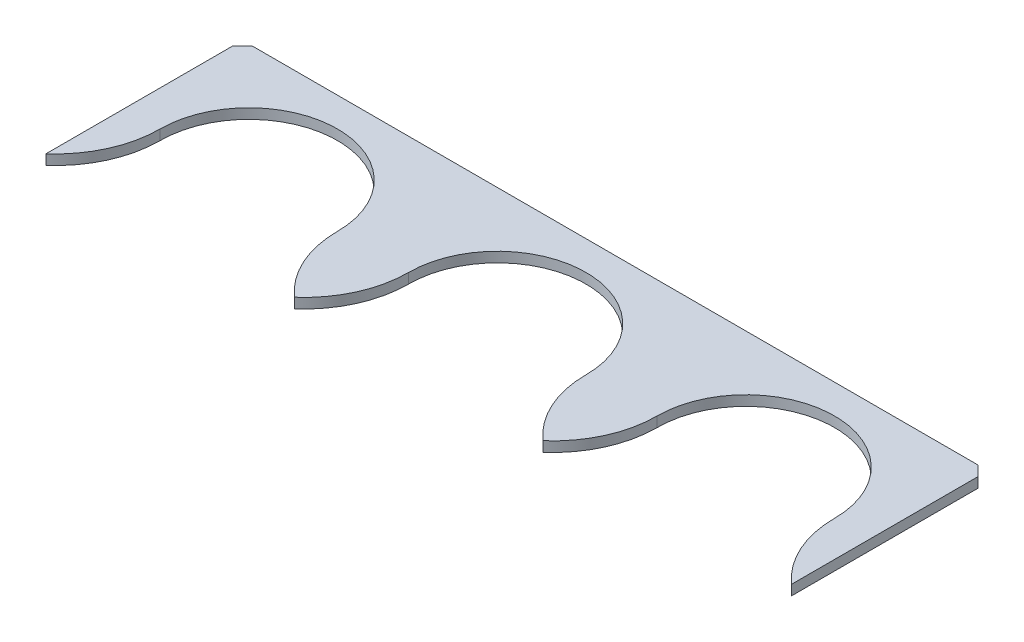
ISO-10303-21;
HEADER;
FILE_DESCRIPTION(('STEP AP214'),'2;1');
FILE_NAME('part.step','',(''),(''),'','','');
FILE_SCHEMA(('AUTOMOTIVE_DESIGN { 1 0 10303 214 1 1 1 1 }'));
ENDSEC;
DATA;
#1=APPLICATION_CONTEXT('core data for automotive mechanical design processes');
#2=APPLICATION_PROTOCOL_DEFINITION('international standard','automotive_design',2000,#1);
#3=PRODUCT_CONTEXT('',#1,'mechanical');
#4=PRODUCT('Part','Part','',(#3));
#5=PRODUCT_RELATED_PRODUCT_CATEGORY('part','',(#4));
#6=PRODUCT_DEFINITION_FORMATION('','',#4);
#7=PRODUCT_DEFINITION_CONTEXT('part definition',#1,'design');
#8=PRODUCT_DEFINITION('design','',#6,#7);
#9=PRODUCT_DEFINITION_SHAPE('','',#8);
#10=(LENGTH_UNIT() NAMED_UNIT(*) SI_UNIT(.MILLI.,.METRE.));
#11=(NAMED_UNIT(*) PLANE_ANGLE_UNIT() SI_UNIT($,.RADIAN.));
#12=(NAMED_UNIT(*) SI_UNIT($,.STERADIAN.) SOLID_ANGLE_UNIT());
#13=UNCERTAINTY_MEASURE_WITH_UNIT(LENGTH_MEASURE(1.E-05),#10,'distance_accuracy_value','');
#14=(GEOMETRIC_REPRESENTATION_CONTEXT(3) GLOBAL_UNCERTAINTY_ASSIGNED_CONTEXT((#13)) GLOBAL_UNIT_ASSIGNED_CONTEXT((#10,
#11,#12)) REPRESENTATION_CONTEXT('',''));
#15=CARTESIAN_POINT('',(0.,0.,0.));
#16=DIRECTION('',(0.,0.,1.));
#17=DIRECTION('',(1.,0.,0.));
#18=AXIS2_PLACEMENT_3D('',#15,#16,#17);
#19=CARTESIAN_POINT('',(-42.1859712464759,-6.35,34.3739942350874));
#20=DIRECTION('',(0.,1.,0.));
#21=DIRECTION('',(0.,0.,1.));
#22=AXIS2_PLACEMENT_3D('',#19,#20,#21);
#23=CYLINDRICAL_SURFACE('',#22,55.88);
#24=CARTESIAN_POINT('',(-42.1859712464759,0.,34.3739942350874));
#25=DIRECTION('',(0.,1.,0.));
#26=DIRECTION('',(0.,0.,1.));
#27=AXIS2_PLACEMENT_3D('',#24,#25,#26);
#28=CIRCLE('',#27,55.88);
#29=CARTESIAN_POINT('',(13.6940287535241,0.,34.3739942350874));
#30=VERTEX_POINT('',#29);
#31=CARTESIAN_POINT('',(-98.0659712464759,0.,34.3739942350875));
#32=VERTEX_POINT('',#31);
#33=EDGE_CURVE('E164',#30,#32,#28,.T.);
#34=ORIENTED_EDGE('',*,*,#33,.T.);
#35=DIRECTION('',(0.,1.,0.));
#36=VECTOR('',#35,1.);
#37=CARTESIAN_POINT('',(-98.0659712464759,-6.35,34.3739942350875));
#38=LINE('',#37,#36);
#39=CARTESIAN_POINT('',(-98.0659712464759,-6.35,34.3739942350875));
#40=VERTEX_POINT('',#39);
#41=EDGE_CURVE('E11',#40,#32,#38,.T.);
#42=ORIENTED_EDGE('',*,*,#41,.F.);
#43=CARTESIAN_POINT('',(-42.1859712464759,-6.35,34.3739942350874));
#44=DIRECTION('',(0.,1.,0.));
#45=DIRECTION('',(0.,0.,1.));
#46=AXIS2_PLACEMENT_3D('',#43,#44,#45);
#47=CIRCLE('',#46,55.88);
#48=CARTESIAN_POINT('',(13.6940287535241,-6.35,34.3739942350874));
#49=VERTEX_POINT('',#48);
#50=EDGE_CURVE('E196',#49,#40,#47,.T.);
#51=ORIENTED_EDGE('',*,*,#50,.F.);
#52=DIRECTION('',(0.,1.,0.));
#53=VECTOR('',#52,1.);
#54=CARTESIAN_POINT('',(13.6940287535241,-6.35,34.3739942350874));
#55=LINE('',#54,#53);
#56=EDGE_CURVE('E37',#49,#30,#55,.T.);
#57=ORIENTED_EDGE('',*,*,#56,.T.);
#58=EDGE_LOOP('',(#34,#42,#51,#57));
#59=FACE_BOUND('',#58,.T.);
#60=ADVANCED_FACE('F34',(#59),#23,.F.);
#61=CARTESIAN_POINT('',(-163.970614847835,-6.35,34.3739942350875));
#62=DIRECTION('',(0.,1.,0.));
#63=DIRECTION('',(0.,0.,1.));
#64=AXIS2_PLACEMENT_3D('',#61,#62,#63);
#65=CYLINDRICAL_SURFACE('',#64,65.9046436013589);
#66=CARTESIAN_POINT('',(-163.970614847835,0.,34.3739942350875));
#67=DIRECTION('',(0.,1.,0.));
#68=DIRECTION('',(0.,0.,1.));
#69=AXIS2_PLACEMENT_3D('',#66,#67,#68);
#70=CIRCLE('',#69,65.9046436013589);
#71=CARTESIAN_POINT('',(-120.494171246476,0.,83.9039942350875));
#72=VERTEX_POINT('',#71);
#73=EDGE_CURVE('E103',#32,#72,#70,.F.);
#74=ORIENTED_EDGE('',*,*,#73,.T.);
#75=DIRECTION('',(0.,1.,0.));
#76=VECTOR('',#75,1.);
#77=CARTESIAN_POINT('',(-120.494171246476,-6.35,83.9039942350875));
#78=LINE('',#77,#76);
#79=CARTESIAN_POINT('',(-120.494171246476,-6.35,83.9039942350875));
#80=VERTEX_POINT('',#79);
#81=EDGE_CURVE('E43',#80,#72,#78,.T.);
#82=ORIENTED_EDGE('',*,*,#81,.F.);
#83=CARTESIAN_POINT('',(-163.970614847835,-6.35,34.3739942350875));
#84=DIRECTION('',(0.,1.,0.));
#85=DIRECTION('',(0.,0.,1.));
#86=AXIS2_PLACEMENT_3D('',#83,#84,#85);
#87=CIRCLE('',#86,65.9046436013589);
#88=EDGE_CURVE('E51',#40,#80,#87,.F.);
#89=ORIENTED_EDGE('',*,*,#88,.F.);
#90=ORIENTED_EDGE('',*,*,#41,.T.);
#91=EDGE_LOOP('',(#74,#82,#89,#90));
#92=FACE_BOUND('',#91,.T.);
#93=ADVANCED_FACE('F238',(#92),#65,.T.);
#94=CARTESIAN_POINT('',(-120.494171246476,-6.35,25.1664942350875));
#95=DIRECTION('',(-1.,0.,0.));
#96=DIRECTION('',(0.,0.,1.));
#97=AXIS2_PLACEMENT_3D('',#94,#95,#96);
#98=PLANE('',#97);
#99=DIRECTION('',(0.,0.,1.));
#100=VECTOR('',#99,1.);
#101=CARTESIAN_POINT('',(-120.494171246476,0.,25.1664942350875));
#102=LINE('',#101,#100);
#103=CARTESIAN_POINT('',(-120.494171246476,0.,-33.5710057649125));
#104=VERTEX_POINT('',#103);
#105=EDGE_CURVE('E146',#104,#72,#102,.T.);
#106=ORIENTED_EDGE('',*,*,#105,.F.);
#107=DIRECTION('',(0.,1.,0.));
#108=VECTOR('',#107,1.);
#109=CARTESIAN_POINT('',(-120.494171246476,-6.35,-33.5710057649125));
#110=LINE('',#109,#108);
#111=CARTESIAN_POINT('',(-120.494171246476,-6.35,-33.5710057649125));
#112=VERTEX_POINT('',#111);
#113=EDGE_CURVE('E141',#112,#104,#110,.T.);
#114=ORIENTED_EDGE('',*,*,#113,.F.);
#115=DIRECTION('',(0.,0.,1.));
#116=VECTOR('',#115,1.);
#117=CARTESIAN_POINT('',(-120.494171246476,-6.35,25.1664942350875));
#118=LINE('',#117,#116);
#119=EDGE_CURVE('E145',#112,#80,#118,.T.);
#120=ORIENTED_EDGE('',*,*,#119,.T.);
#121=ORIENTED_EDGE('',*,*,#81,.T.);
#122=EDGE_LOOP('',(#106,#114,#120,#121));
#123=FACE_BOUND('',#122,.T.);
#124=ADVANCED_FACE('F143',(#123),#98,.T.);
#125=CARTESIAN_POINT('',(-222.089643416732,-6.35,68.0244664053438));
#126=DIRECTION('',(0.707106781186548,0.,0.707106781186547));
#127=DIRECTION('',(0.707106781186547,0.,-0.707106781186548));
#128=AXIS2_PLACEMENT_3D('',#125,#126,#127);
#129=PLANE('',#128);
#130=DIRECTION('',(0.707106781186547,0.,-0.707106781186548));
#131=VECTOR('',#130,1.);
#132=CARTESIAN_POINT('',(-222.089643416732,0.,68.0244664053438));
#133=LINE('',#132,#131);
#134=CARTESIAN_POINT('',(-114.144171246476,0.,-39.9210057649125));
#135=VERTEX_POINT('',#134);
#136=EDGE_CURVE('E193',#104,#135,#133,.T.);
#137=ORIENTED_EDGE('',*,*,#136,.T.);
#138=DIRECTION('',(0.,1.,0.));
#139=VECTOR('',#138,1.);
#140=CARTESIAN_POINT('',(-114.144171246476,-6.35,-39.9210057649125));
#141=LINE('',#140,#139);
#142=CARTESIAN_POINT('',(-114.144171246476,-6.35,-39.9210057649125));
#143=VERTEX_POINT('',#142);
#144=EDGE_CURVE('E149',#143,#135,#141,.T.);
#145=ORIENTED_EDGE('',*,*,#144,.F.);
#146=DIRECTION('',(0.707106781186547,0.,-0.707106781186548));
#147=VECTOR('',#146,1.);
#148=CARTESIAN_POINT('',(-222.089643416732,-6.35,68.0244664053438));
#149=LINE('',#148,#147);
#150=EDGE_CURVE('E152',#112,#143,#149,.T.);
#151=ORIENTED_EDGE('',*,*,#150,.F.);
#152=ORIENTED_EDGE('',*,*,#113,.T.);
#153=EDGE_LOOP('',(#137,#145,#151,#152));
#154=FACE_BOUND('',#153,.T.);
#155=ADVANCED_FACE('F153',(#154),#129,.F.);
#156=CARTESIAN_POINT('',(-264.947615586989,-6.35,-39.9210057649125));
#157=DIRECTION('',(0.,0.,1.));
#158=DIRECTION('',(1.,0.,0.));
#159=AXIS2_PLACEMENT_3D('',#156,#157,#158);
#160=PLANE('',#159);
#161=DIRECTION('',(1.,0.,0.));
#162=VECTOR('',#161,1.);
#163=CARTESIAN_POINT('',(-264.947615586989,0.,-39.9210057649125));
#164=LINE('',#163,#162);
#165=CARTESIAN_POINT('',(343.055828753524,0.,-39.9210057649126));
#166=VERTEX_POINT('',#165);
#167=EDGE_CURVE('E191',#135,#166,#164,.T.);
#168=ORIENTED_EDGE('',*,*,#167,.T.);
#169=DIRECTION('',(0.,1.,0.));
#170=VECTOR('',#169,1.);
#171=CARTESIAN_POINT('',(343.055828753524,-6.35,-39.9210057649126));
#172=LINE('',#171,#170);
#173=CARTESIAN_POINT('',(343.055828753524,-6.35,-39.9210057649126));
#174=VERTEX_POINT('',#173);
#175=EDGE_CURVE('E200',#174,#166,#172,.T.);
#176=ORIENTED_EDGE('',*,*,#175,.F.);
#177=DIRECTION('',(1.,0.,0.));
#178=VECTOR('',#177,1.);
#179=CARTESIAN_POINT('',(-264.947615586989,-6.35,-39.9210057649125));
#180=LINE('',#179,#178);
#181=EDGE_CURVE('E157',#143,#174,#180,.T.);
#182=ORIENTED_EDGE('',*,*,#181,.F.);
#183=ORIENTED_EDGE('',*,*,#144,.T.);
#184=EDGE_LOOP('',(#168,#176,#182,#183));
#185=FACE_BOUND('',#184,.T.);
#186=ADVANCED_FACE('F251',(#185),#160,.F.);
#187=CARTESIAN_POINT('',(71.5978565832693,-6.35,-311.378977935169));
#188=DIRECTION('',(-0.707106781186549,0.,0.707106781186546));
#189=DIRECTION('',(0.707106781186546,0.,0.707106781186549));
#190=AXIS2_PLACEMENT_3D('',#187,#188,#189);
#191=PLANE('',#190);
#192=DIRECTION('',(0.707106781186546,0.,0.707106781186549));
#193=VECTOR('',#192,1.);
#194=CARTESIAN_POINT('',(71.5978565832693,0.,-311.378977935169));
#195=LINE('',#194,#193);
#196=CARTESIAN_POINT('',(349.405828753524,0.,-33.5710057649123));
#197=VERTEX_POINT('',#196);
#198=EDGE_CURVE('E189',#166,#197,#195,.T.);
#199=ORIENTED_EDGE('',*,*,#198,.T.);
#200=DIRECTION('',(0.,1.,0.));
#201=VECTOR('',#200,1.);
#202=CARTESIAN_POINT('',(349.405828753524,-6.35,-33.5710057649123));
#203=LINE('',#202,#201);
#204=CARTESIAN_POINT('',(349.405828753524,-6.35,-33.5710057649123));
#205=VERTEX_POINT('',#204);
#206=EDGE_CURVE('E203',#205,#197,#203,.T.);
#207=ORIENTED_EDGE('',*,*,#206,.F.);
#208=DIRECTION('',(0.707106781186546,0.,0.707106781186549));
#209=VECTOR('',#208,1.);
#210=CARTESIAN_POINT('',(71.5978565832693,-6.35,-311.378977935169));
#211=LINE('',#210,#209);
#212=EDGE_CURVE('E308',#174,#205,#211,.T.);
#213=ORIENTED_EDGE('',*,*,#212,.F.);
#214=ORIENTED_EDGE('',*,*,#175,.T.);
#215=EDGE_LOOP('',(#199,#207,#213,#214));
#216=FACE_BOUND('',#215,.T.);
#217=ADVANCED_FACE('F254',(#216),#191,.F.);
#218=CARTESIAN_POINT('',(349.405828753524,-6.35,25.1664942350872));
#219=DIRECTION('',(-1.,0.,0.));
#220=DIRECTION('',(0.,0.,1.));
#221=AXIS2_PLACEMENT_3D('',#218,#219,#220);
#222=PLANE('',#221);
#223=DIRECTION('',(0.,0.,1.));
#224=VECTOR('',#223,1.);
#225=CARTESIAN_POINT('',(349.405828753524,0.,25.1664942350872));
#226=LINE('',#225,#224);
#227=CARTESIAN_POINT('',(349.405828753524,0.,83.9039942350875));
#228=VERTEX_POINT('',#227);
#229=EDGE_CURVE('E186',#197,#228,#226,.T.);
#230=ORIENTED_EDGE('',*,*,#229,.T.);
#231=DIRECTION('',(0.,1.,0.));
#232=VECTOR('',#231,1.);
#233=CARTESIAN_POINT('',(349.405828753524,-6.35,83.9039942350875));
#234=LINE('',#233,#232);
#235=CARTESIAN_POINT('',(349.405828753524,-6.35,83.9039942350875));
#236=VERTEX_POINT('',#235);
#237=EDGE_CURVE('E206',#236,#228,#234,.T.);
#238=ORIENTED_EDGE('',*,*,#237,.F.);
#239=DIRECTION('',(0.,0.,1.));
#240=VECTOR('',#239,1.);
#241=CARTESIAN_POINT('',(349.405828753524,-6.35,25.1664942350872));
#242=LINE('',#241,#240);
#243=EDGE_CURVE('E306',#205,#236,#242,.T.);
#244=ORIENTED_EDGE('',*,*,#243,.F.);
#245=ORIENTED_EDGE('',*,*,#206,.T.);
#246=EDGE_LOOP('',(#230,#238,#244,#245));
#247=FACE_BOUND('',#246,.T.);
#248=ADVANCED_FACE('F258',(#247),#222,.F.);
#249=CARTESIAN_POINT('',(392.807705224112,-6.35,34.3739942350875));
#250=DIRECTION('',(0.,1.,0.));
#251=DIRECTION('',(0.,0.,1.));
#252=AXIS2_PLACEMENT_3D('',#249,#250,#251);
#253=CYLINDRICAL_SURFACE('',#252,65.8554764705882);
#254=CARTESIAN_POINT('',(392.807705224112,0.,34.3739942350875));
#255=DIRECTION('',(0.,1.,0.));
#256=DIRECTION('',(0.,0.,1.));
#257=AXIS2_PLACEMENT_3D('',#254,#255,#256);
#258=CIRCLE('',#257,65.8554764705882);
#259=CARTESIAN_POINT('',(326.952228753524,0.,34.3739942350875));
#260=VERTEX_POINT('',#259);
#261=EDGE_CURVE('E183',#260,#228,#258,.T.);
#262=ORIENTED_EDGE('',*,*,#261,.F.);
#263=DIRECTION('',(0.,1.,0.));
#264=VECTOR('',#263,1.);
#265=CARTESIAN_POINT('',(326.952228753524,-6.35,34.3739942350875));
#266=LINE('',#265,#264);
#267=CARTESIAN_POINT('',(326.952228753524,-6.35,34.3739942350875));
#268=VERTEX_POINT('',#267);
#269=EDGE_CURVE('E208',#268,#260,#266,.T.);
#270=ORIENTED_EDGE('',*,*,#269,.F.);
#271=CARTESIAN_POINT('',(392.807705224112,-6.35,34.3739942350875));
#272=DIRECTION('',(0.,1.,0.));
#273=DIRECTION('',(0.,0.,1.));
#274=AXIS2_PLACEMENT_3D('',#271,#272,#273);
#275=CIRCLE('',#274,65.8554764705882);
#276=EDGE_CURVE('E303',#268,#236,#275,.T.);
#277=ORIENTED_EDGE('',*,*,#276,.T.);
#278=ORIENTED_EDGE('',*,*,#237,.T.);
#279=EDGE_LOOP('',(#262,#270,#277,#278));
#280=FACE_BOUND('',#279,.T.);
#281=ADVANCED_FACE('F262',(#280),#253,.T.);
#282=CARTESIAN_POINT('',(271.072228753524,-6.35,34.3739942350874));
#283=DIRECTION('',(0.,1.,0.));
#284=DIRECTION('',(0.,0.,1.));
#285=AXIS2_PLACEMENT_3D('',#282,#283,#284);
#286=CYLINDRICAL_SURFACE('',#285,55.88);
#287=CARTESIAN_POINT('',(271.072228753524,0.,34.3739942350874));
#288=DIRECTION('',(0.,1.,0.));
#289=DIRECTION('',(0.,0.,1.));
#290=AXIS2_PLACEMENT_3D('',#287,#288,#289);
#291=CIRCLE('',#290,55.88);
#292=CARTESIAN_POINT('',(215.192228753524,0.,34.3739942350874));
#293=VERTEX_POINT('',#292);
#294=EDGE_CURVE('E181',#260,#293,#291,.T.);
#295=ORIENTED_EDGE('',*,*,#294,.T.);
#296=DIRECTION('',(0.,1.,0.));
#297=VECTOR('',#296,1.);
#298=CARTESIAN_POINT('',(215.192228753524,-6.35,34.3739942350874));
#299=LINE('',#298,#297);
#300=CARTESIAN_POINT('',(215.192228753524,-6.35,34.3739942350874));
#301=VERTEX_POINT('',#300);
#302=EDGE_CURVE('E210',#301,#293,#299,.T.);
#303=ORIENTED_EDGE('',*,*,#302,.F.);
#304=CARTESIAN_POINT('',(271.072228753524,-6.35,34.3739942350874));
#305=DIRECTION('',(0.,1.,0.));
#306=DIRECTION('',(0.,0.,1.));
#307=AXIS2_PLACEMENT_3D('',#304,#305,#306);
#308=CIRCLE('',#307,55.88);
#309=EDGE_CURVE('E301',#268,#301,#308,.T.);
#310=ORIENTED_EDGE('',*,*,#309,.F.);
#311=ORIENTED_EDGE('',*,*,#269,.T.);
#312=EDGE_LOOP('',(#295,#303,#310,#311));
#313=FACE_BOUND('',#312,.T.);
#314=ADVANCED_FACE('F266',(#313),#286,.F.);
#315=CARTESIAN_POINT('',(149.336752282935,-6.35,34.3739942350873));
#316=DIRECTION('',(0.,1.,0.));
#317=DIRECTION('',(0.,0.,1.));
#318=AXIS2_PLACEMENT_3D('',#315,#316,#317);
#319=CYLINDRICAL_SURFACE('',#318,65.8554764705887);
#320=CARTESIAN_POINT('',(149.336752282935,0.,34.3739942350873));
#321=DIRECTION('',(0.,1.,0.));
#322=DIRECTION('',(0.,0.,1.));
#323=AXIS2_PLACEMENT_3D('',#320,#321,#322);
#324=CIRCLE('',#323,65.8554764705887);
#325=CARTESIAN_POINT('',(192.738628753524,0.,83.9039942350875));
#326=VERTEX_POINT('',#325);
#327=EDGE_CURVE('E178',#293,#326,#324,.F.);
#328=ORIENTED_EDGE('',*,*,#327,.T.);
#329=DIRECTION('',(0.,1.,0.));
#330=VECTOR('',#329,1.);
#331=CARTESIAN_POINT('',(192.738628753524,-6.35,83.9039942350875));
#332=LINE('',#331,#330);
#333=CARTESIAN_POINT('',(192.738628753524,-6.35,83.9039942350875));
#334=VERTEX_POINT('',#333);
#335=EDGE_CURVE('E213',#334,#326,#332,.T.);
#336=ORIENTED_EDGE('',*,*,#335,.F.);
#337=CARTESIAN_POINT('',(149.336752282935,-6.35,34.3739942350873));
#338=DIRECTION('',(0.,1.,0.));
#339=DIRECTION('',(0.,0.,1.));
#340=AXIS2_PLACEMENT_3D('',#337,#338,#339);
#341=CIRCLE('',#340,65.8554764705887);
#342=EDGE_CURVE('E299',#301,#334,#341,.F.);
#343=ORIENTED_EDGE('',*,*,#342,.F.);
#344=ORIENTED_EDGE('',*,*,#302,.T.);
#345=EDGE_LOOP('',(#328,#336,#343,#344));
#346=FACE_BOUND('',#345,.T.);
#347=ADVANCED_FACE('F270',(#346),#319,.T.);
#348=CARTESIAN_POINT('',(236.215072354883,-6.35,34.3739942350875));
#349=DIRECTION('',(0.,1.,0.));
#350=DIRECTION('',(0.,0.,1.));
#351=AXIS2_PLACEMENT_3D('',#348,#349,#350);
#352=CYLINDRICAL_SURFACE('',#351,65.904643601359);
#353=CARTESIAN_POINT('',(236.215072354883,0.,34.3739942350875));
#354=DIRECTION('',(0.,1.,0.));
#355=DIRECTION('',(0.,0.,1.));
#356=AXIS2_PLACEMENT_3D('',#353,#354,#355);
#357=CIRCLE('',#356,65.904643601359);
#358=CARTESIAN_POINT('',(170.310428753524,0.,34.3739942350874));
#359=VERTEX_POINT('',#358);
#360=EDGE_CURVE('E175',#359,#326,#357,.T.);
#361=ORIENTED_EDGE('',*,*,#360,.F.);
#362=DIRECTION('',(0.,1.,0.));
#363=VECTOR('',#362,1.);
#364=CARTESIAN_POINT('',(170.310428753524,-6.35,34.3739942350874));
#365=LINE('',#364,#363);
#366=CARTESIAN_POINT('',(170.310428753524,-6.35,34.3739942350874));
#367=VERTEX_POINT('',#366);
#368=EDGE_CURVE('E215',#367,#359,#365,.T.);
#369=ORIENTED_EDGE('',*,*,#368,.F.);
#370=CARTESIAN_POINT('',(236.215072354883,-6.35,34.3739942350875));
#371=DIRECTION('',(0.,1.,0.));
#372=DIRECTION('',(0.,0.,1.));
#373=AXIS2_PLACEMENT_3D('',#370,#371,#372);
#374=CIRCLE('',#373,65.904643601359);
#375=EDGE_CURVE('E292',#367,#334,#374,.T.);
#376=ORIENTED_EDGE('',*,*,#375,.T.);
#377=ORIENTED_EDGE('',*,*,#335,.T.);
#378=EDGE_LOOP('',(#361,#369,#376,#377));
#379=FACE_BOUND('',#378,.T.);
#380=ADVANCED_FACE('F274',(#379),#352,.T.);
#381=CARTESIAN_POINT('',(114.430428753524,-6.35,34.3739942350874));
#382=DIRECTION('',(0.,1.,0.));
#383=DIRECTION('',(0.,0.,1.));
#384=AXIS2_PLACEMENT_3D('',#381,#382,#383);
#385=CYLINDRICAL_SURFACE('',#384,55.88);
#386=CARTESIAN_POINT('',(114.430428753524,0.,34.3739942350874));
#387=DIRECTION('',(0.,1.,0.));
#388=DIRECTION('',(0.,0.,1.));
#389=AXIS2_PLACEMENT_3D('',#386,#387,#388);
#390=CIRCLE('',#389,55.88);
#391=CARTESIAN_POINT('',(58.5504287535241,0.,34.3739942350874));
#392=VERTEX_POINT('',#391);
#393=EDGE_CURVE('E173',#359,#392,#390,.T.);
#394=ORIENTED_EDGE('',*,*,#393,.T.);
#395=DIRECTION('',(0.,1.,0.));
#396=VECTOR('',#395,1.);
#397=CARTESIAN_POINT('',(58.5504287535241,-6.35,34.3739942350874));
#398=LINE('',#397,#396);
#399=CARTESIAN_POINT('',(58.5504287535241,-6.35,34.3739942350874));
#400=VERTEX_POINT('',#399);
#401=EDGE_CURVE('E217',#400,#392,#398,.T.);
#402=ORIENTED_EDGE('',*,*,#401,.F.);
#403=CARTESIAN_POINT('',(114.430428753524,-6.35,34.3739942350874));
#404=DIRECTION('',(0.,1.,0.));
#405=DIRECTION('',(0.,0.,1.));
#406=AXIS2_PLACEMENT_3D('',#403,#404,#405);
#407=CIRCLE('',#406,55.88);
#408=EDGE_CURVE('E289',#367,#400,#407,.T.);
#409=ORIENTED_EDGE('',*,*,#408,.F.);
#410=ORIENTED_EDGE('',*,*,#368,.T.);
#411=EDGE_LOOP('',(#394,#402,#409,#410));
#412=FACE_BOUND('',#411,.T.);
#413=ADVANCED_FACE('F234',(#412),#385,.F.);
#414=CARTESIAN_POINT('',(-7.35421484783522,-6.35,34.3739942350873));
#415=DIRECTION('',(0.,1.,0.));
#416=DIRECTION('',(0.,0.,1.));
#417=AXIS2_PLACEMENT_3D('',#414,#415,#416);
#418=CYLINDRICAL_SURFACE('',#417,65.9046436013593);
#419=CARTESIAN_POINT('',(-7.35421484783522,0.,34.3739942350873));
#420=DIRECTION('',(0.,1.,0.));
#421=DIRECTION('',(0.,0.,1.));
#422=AXIS2_PLACEMENT_3D('',#419,#420,#421);
#423=CIRCLE('',#422,65.9046436013593);
#424=CARTESIAN_POINT('',(36.1222287535241,0.,83.9039942350875));
#425=VERTEX_POINT('',#424);
#426=EDGE_CURVE('E170',#392,#425,#423,.F.);
#427=ORIENTED_EDGE('',*,*,#426,.T.);
#428=DIRECTION('',(0.,1.,0.));
#429=VECTOR('',#428,1.);
#430=CARTESIAN_POINT('',(36.1222287535241,-6.35,83.9039942350875));
#431=LINE('',#430,#429);
#432=CARTESIAN_POINT('',(36.1222287535241,-6.35,83.9039942350875));
#433=VERTEX_POINT('',#432);
#434=EDGE_CURVE('E219',#433,#425,#431,.T.);
#435=ORIENTED_EDGE('',*,*,#434,.F.);
#436=CARTESIAN_POINT('',(-7.35421484783522,-6.35,34.3739942350873));
#437=DIRECTION('',(0.,1.,0.));
#438=DIRECTION('',(0.,0.,1.));
#439=AXIS2_PLACEMENT_3D('',#436,#437,#438);
#440=CIRCLE('',#439,65.9046436013593);
#441=EDGE_CURVE('E288',#400,#433,#440,.F.);
#442=ORIENTED_EDGE('',*,*,#441,.F.);
#443=ORIENTED_EDGE('',*,*,#401,.T.);
#444=EDGE_LOOP('',(#427,#435,#442,#443));
#445=FACE_BOUND('',#444,.T.);
#446=ADVANCED_FACE('F228',(#445),#418,.T.);
#447=CARTESIAN_POINT('',(79.5986723548832,-6.35,34.3739942350874));
#448=DIRECTION('',(0.,1.,0.));
#449=DIRECTION('',(0.,0.,1.));
#450=AXIS2_PLACEMENT_3D('',#447,#448,#449);
#451=CYLINDRICAL_SURFACE('',#450,65.9046436013591);
#452=CARTESIAN_POINT('',(79.5986723548832,0.,34.3739942350874));
#453=DIRECTION('',(0.,1.,0.));
#454=DIRECTION('',(0.,0.,1.));
#455=AXIS2_PLACEMENT_3D('',#452,#453,#454);
#456=CIRCLE('',#455,65.9046436013591);
#457=EDGE_CURVE('E167',#30,#425,#456,.T.);
#458=ORIENTED_EDGE('',*,*,#457,.F.);
#459=ORIENTED_EDGE('',*,*,#56,.F.);
#460=CARTESIAN_POINT('',(79.5986723548832,-6.35,34.3739942350874));
#461=DIRECTION('',(0.,1.,0.));
#462=DIRECTION('',(0.,0.,1.));
#463=AXIS2_PLACEMENT_3D('',#460,#461,#462);
#464=CIRCLE('',#463,65.9046436013591);
#465=EDGE_CURVE('E290',#49,#433,#464,.T.);
#466=ORIENTED_EDGE('',*,*,#465,.T.);
#467=ORIENTED_EDGE('',*,*,#434,.T.);
#468=EDGE_LOOP('',(#458,#459,#466,#467));
#469=FACE_BOUND('',#468,.T.);
#470=ADVANCED_FACE('F226',(#469),#451,.T.);
#471=CARTESIAN_POINT('',(-264.947615586989,-6.35,25.1664942350875));
#472=DIRECTION('',(0.,1.,0.));
#473=DIRECTION('',(0.,0.,1.));
#474=AXIS2_PLACEMENT_3D('',#471,#472,#473);
#475=PLANE('',#474);
#476=ORIENTED_EDGE('',*,*,#50,.T.);
#477=ORIENTED_EDGE('',*,*,#88,.T.);
#478=ORIENTED_EDGE('',*,*,#119,.F.);
#479=ORIENTED_EDGE('',*,*,#150,.T.);
#480=ORIENTED_EDGE('',*,*,#181,.T.);
#481=ORIENTED_EDGE('',*,*,#212,.T.);
#482=ORIENTED_EDGE('',*,*,#243,.T.);
#483=ORIENTED_EDGE('',*,*,#276,.F.);
#484=ORIENTED_EDGE('',*,*,#309,.T.);
#485=ORIENTED_EDGE('',*,*,#342,.T.);
#486=ORIENTED_EDGE('',*,*,#375,.F.);
#487=ORIENTED_EDGE('',*,*,#408,.T.);
#488=ORIENTED_EDGE('',*,*,#441,.T.);
#489=ORIENTED_EDGE('',*,*,#465,.F.);
#490=EDGE_LOOP('',(#476,#477,#478,#479,#480,#481,#482,#483,#484,#485,#486,#487,#488,#489));
#491=FACE_BOUND('',#490,.T.);
#492=ADVANCED_FACE('F159',(#491),#475,.F.);
#493=CARTESIAN_POINT('',(-264.947615586989,0.,25.1664942350875));
#494=DIRECTION('',(0.,1.,0.));
#495=DIRECTION('',(0.,0.,1.));
#496=AXIS2_PLACEMENT_3D('',#493,#494,#495);
#497=PLANE('',#496);
#498=ORIENTED_EDGE('',*,*,#33,.F.);
#499=ORIENTED_EDGE('',*,*,#457,.T.);
#500=ORIENTED_EDGE('',*,*,#426,.F.);
#501=ORIENTED_EDGE('',*,*,#393,.F.);
#502=ORIENTED_EDGE('',*,*,#360,.T.);
#503=ORIENTED_EDGE('',*,*,#327,.F.);
#504=ORIENTED_EDGE('',*,*,#294,.F.);
#505=ORIENTED_EDGE('',*,*,#261,.T.);
#506=ORIENTED_EDGE('',*,*,#229,.F.);
#507=ORIENTED_EDGE('',*,*,#198,.F.);
#508=ORIENTED_EDGE('',*,*,#167,.F.);
#509=ORIENTED_EDGE('',*,*,#136,.F.);
#510=ORIENTED_EDGE('',*,*,#105,.T.);
#511=ORIENTED_EDGE('',*,*,#73,.F.);
#512=EDGE_LOOP('',(#498,#499,#500,#501,#502,#503,#504,#505,#506,#507,#508,#509,#510,#511));
#513=FACE_BOUND('',#512,.T.);
#514=ADVANCED_FACE('F224',(#513),#497,.T.);
#515=CLOSED_SHELL('',(#60,#93,#124,#155,#186,#217,#248,#281,#314,#347,#380,#413,#446,#470,#492,#514));
#516=MANIFOLD_SOLID_BREP('B2',#515);
#517=ADVANCED_BREP_SHAPE_REPRESENTATION('',(#18,#516),#14);
#518=SHAPE_DEFINITION_REPRESENTATION(#9,#517);
ENDSEC;
END-ISO-10303-21;
